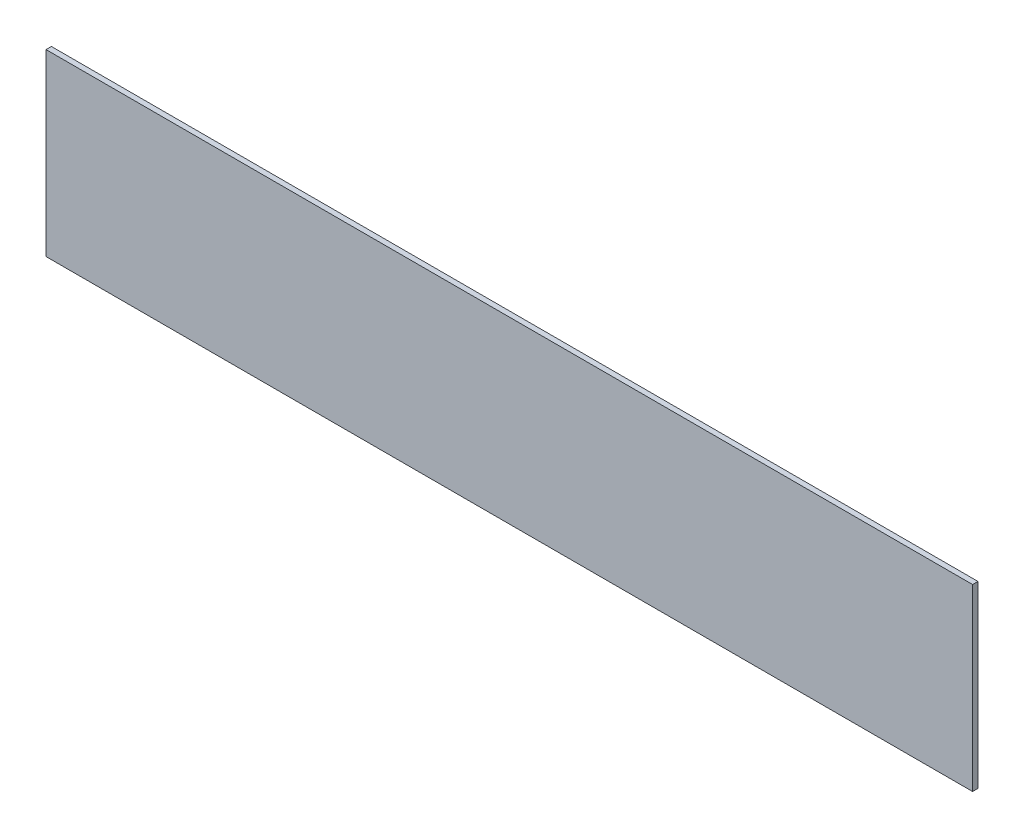
ISO-10303-21;
HEADER;
FILE_DESCRIPTION(('STEP AP214'),'2;1');
FILE_NAME('part.step','',(''),(''),'','','');
FILE_SCHEMA(('AUTOMOTIVE_DESIGN { 1 0 10303 214 1 1 1 1 }'));
ENDSEC;
DATA;
#1=APPLICATION_CONTEXT('core data for automotive mechanical design processes');
#2=APPLICATION_PROTOCOL_DEFINITION('international standard','automotive_design',2000,#1);
#3=PRODUCT_CONTEXT('',#1,'mechanical');
#4=PRODUCT('Part','Part','',(#3));
#5=PRODUCT_RELATED_PRODUCT_CATEGORY('part','',(#4));
#6=PRODUCT_DEFINITION_FORMATION('','',#4);
#7=PRODUCT_DEFINITION_CONTEXT('part definition',#1,'design');
#8=PRODUCT_DEFINITION('design','',#6,#7);
#9=PRODUCT_DEFINITION_SHAPE('','',#8);
#10=(LENGTH_UNIT() NAMED_UNIT(*) SI_UNIT(.MILLI.,.METRE.));
#11=(NAMED_UNIT(*) PLANE_ANGLE_UNIT() SI_UNIT($,.RADIAN.));
#12=(NAMED_UNIT(*) SI_UNIT($,.STERADIAN.) SOLID_ANGLE_UNIT());
#13=UNCERTAINTY_MEASURE_WITH_UNIT(LENGTH_MEASURE(1.E-05),#10,'distance_accuracy_value','');
#14=(GEOMETRIC_REPRESENTATION_CONTEXT(3) GLOBAL_UNCERTAINTY_ASSIGNED_CONTEXT((#13)) GLOBAL_UNIT_ASSIGNED_CONTEXT((#10,
#11,#12)) REPRESENTATION_CONTEXT('',''));
#15=CARTESIAN_POINT('',(0.,0.,0.));
#16=DIRECTION('',(0.,0.,1.));
#17=DIRECTION('',(1.,0.,0.));
#18=AXIS2_PLACEMENT_3D('',#15,#16,#17);
#19=CARTESIAN_POINT('',(0.,0.,0.24));
#20=DIRECTION('',(1.,0.,0.));
#21=DIRECTION('',(0.,0.,-1.));
#22=AXIS2_PLACEMENT_3D('',#19,#20,#21);
#23=PLANE('',#22);
#24=DIRECTION('',(0.,-1.,0.));
#25=VECTOR('',#24,1.);
#26=CARTESIAN_POINT('',(0.,0.,0.));
#27=LINE('',#26,#25);
#28=CARTESIAN_POINT('',(0.,8.,0.));
#29=VERTEX_POINT('',#28);
#30=CARTESIAN_POINT('',(0.,0.,0.));
#31=VERTEX_POINT('',#30);
#32=EDGE_CURVE('E107',#29,#31,#27,.T.);
#33=ORIENTED_EDGE('',*,*,#32,.T.);
#34=DIRECTION('',(0.,0.,-1.));
#35=VECTOR('',#34,1.);
#36=CARTESIAN_POINT('',(0.,0.,0.24));
#37=LINE('',#36,#35);
#38=CARTESIAN_POINT('',(0.,0.,0.24));
#39=VERTEX_POINT('',#38);
#40=EDGE_CURVE('E11',#39,#31,#37,.T.);
#41=ORIENTED_EDGE('',*,*,#40,.F.);
#42=DIRECTION('',(0.,-1.,0.));
#43=VECTOR('',#42,1.);
#44=CARTESIAN_POINT('',(0.,0.,0.24));
#45=LINE('',#44,#43);
#46=CARTESIAN_POINT('',(0.,8.,0.24));
#47=VERTEX_POINT('',#46);
#48=EDGE_CURVE('E91',#47,#39,#45,.T.);
#49=ORIENTED_EDGE('',*,*,#48,.F.);
#50=DIRECTION('',(0.,0.,-1.));
#51=VECTOR('',#50,1.);
#52=CARTESIAN_POINT('',(0.,8.,0.24));
#53=LINE('',#52,#51);
#54=EDGE_CURVE('E103',#47,#29,#53,.T.);
#55=ORIENTED_EDGE('',*,*,#54,.T.);
#56=EDGE_LOOP('',(#33,#41,#49,#55));
#57=FACE_BOUND('',#56,.T.);
#58=ADVANCED_FACE('F39',(#57),#23,.F.);
#59=CARTESIAN_POINT('',(0.,0.,0.24));
#60=DIRECTION('',(0.,1.,0.));
#61=DIRECTION('',(0.,0.,1.));
#62=AXIS2_PLACEMENT_3D('',#59,#60,#61);
#63=PLANE('',#62);
#64=DIRECTION('',(1.,0.,0.));
#65=VECTOR('',#64,1.);
#66=CARTESIAN_POINT('',(0.,0.,0.));
#67=LINE('',#66,#65);
#68=CARTESIAN_POINT('',(41.35,0.,0.));
#69=VERTEX_POINT('',#68);
#70=EDGE_CURVE('E96',#31,#69,#67,.T.);
#71=ORIENTED_EDGE('',*,*,#70,.T.);
#72=DIRECTION('',(0.,0.,-1.));
#73=VECTOR('',#72,1.);
#74=CARTESIAN_POINT('',(41.35,0.,0.24));
#75=LINE('',#74,#73);
#76=CARTESIAN_POINT('',(41.35,0.,0.24));
#77=VERTEX_POINT('',#76);
#78=EDGE_CURVE('E48',#77,#69,#75,.T.);
#79=ORIENTED_EDGE('',*,*,#78,.F.);
#80=DIRECTION('',(1.,0.,0.));
#81=VECTOR('',#80,1.);
#82=CARTESIAN_POINT('',(0.,0.,0.24));
#83=LINE('',#82,#81);
#84=EDGE_CURVE('E86',#39,#77,#83,.T.);
#85=ORIENTED_EDGE('',*,*,#84,.F.);
#86=ORIENTED_EDGE('',*,*,#40,.T.);
#87=EDGE_LOOP('',(#71,#79,#85,#86));
#88=FACE_BOUND('',#87,.T.);
#89=ADVANCED_FACE('F95',(#88),#63,.F.);
#90=CARTESIAN_POINT('',(41.35,0.,0.24));
#91=DIRECTION('',(-1.,0.,0.));
#92=DIRECTION('',(0.,0.,1.));
#93=AXIS2_PLACEMENT_3D('',#90,#91,#92);
#94=PLANE('',#93);
#95=DIRECTION('',(0.,1.,0.));
#96=VECTOR('',#95,1.);
#97=CARTESIAN_POINT('',(41.35,0.,0.));
#98=LINE('',#97,#96);
#99=CARTESIAN_POINT('',(41.35,8.,0.));
#100=VERTEX_POINT('',#99);
#101=EDGE_CURVE('E73',#69,#100,#98,.T.);
#102=ORIENTED_EDGE('',*,*,#101,.T.);
#103=DIRECTION('',(0.,0.,-1.));
#104=VECTOR('',#103,1.);
#105=CARTESIAN_POINT('',(41.35,8.,0.24));
#106=LINE('',#105,#104);
#107=CARTESIAN_POINT('',(41.35,8.,0.24));
#108=VERTEX_POINT('',#107);
#109=EDGE_CURVE('E98',#108,#100,#106,.T.);
#110=ORIENTED_EDGE('',*,*,#109,.F.);
#111=DIRECTION('',(0.,1.,0.));
#112=VECTOR('',#111,1.);
#113=CARTESIAN_POINT('',(41.35,0.,0.24));
#114=LINE('',#113,#112);
#115=EDGE_CURVE('E89',#77,#108,#114,.T.);
#116=ORIENTED_EDGE('',*,*,#115,.F.);
#117=ORIENTED_EDGE('',*,*,#78,.T.);
#118=EDGE_LOOP('',(#102,#110,#116,#117));
#119=FACE_BOUND('',#118,.T.);
#120=ADVANCED_FACE('F99',(#119),#94,.F.);
#121=CARTESIAN_POINT('',(0.,8.,0.24));
#122=DIRECTION('',(0.,-1.,0.));
#123=DIRECTION('',(0.,0.,-1.));
#124=AXIS2_PLACEMENT_3D('',#121,#122,#123);
#125=PLANE('',#124);
#126=DIRECTION('',(-1.,0.,0.));
#127=VECTOR('',#126,1.);
#128=CARTESIAN_POINT('',(0.,8.,0.));
#129=LINE('',#128,#127);
#130=EDGE_CURVE('E79',#100,#29,#129,.T.);
#131=ORIENTED_EDGE('',*,*,#130,.T.);
#132=ORIENTED_EDGE('',*,*,#54,.F.);
#133=DIRECTION('',(-1.,0.,0.));
#134=VECTOR('',#133,1.);
#135=CARTESIAN_POINT('',(0.,8.,0.24));
#136=LINE('',#135,#134);
#137=EDGE_CURVE('E56',#108,#47,#136,.T.);
#138=ORIENTED_EDGE('',*,*,#137,.F.);
#139=ORIENTED_EDGE('',*,*,#109,.T.);
#140=EDGE_LOOP('',(#131,#132,#138,#139));
#141=FACE_BOUND('',#140,.T.);
#142=ADVANCED_FACE('F120',(#141),#125,.F.);
#143=CARTESIAN_POINT('',(0.,0.,0.24));
#144=DIRECTION('',(0.,0.,-1.));
#145=DIRECTION('',(-1.,0.,0.));
#146=AXIS2_PLACEMENT_3D('',#143,#144,#145);
#147=PLANE('',#146);
#148=ORIENTED_EDGE('',*,*,#48,.T.);
#149=ORIENTED_EDGE('',*,*,#84,.T.);
#150=ORIENTED_EDGE('',*,*,#115,.T.);
#151=ORIENTED_EDGE('',*,*,#137,.T.);
#152=EDGE_LOOP('',(#148,#149,#150,#151));
#153=FACE_BOUND('',#152,.T.);
#154=ADVANCED_FACE('F87',(#153),#147,.F.);
#155=CARTESIAN_POINT('',(0.,0.,0.));
#156=DIRECTION('',(0.,0.,-1.));
#157=DIRECTION('',(-1.,0.,0.));
#158=AXIS2_PLACEMENT_3D('',#155,#156,#157);
#159=PLANE('',#158);
#160=ORIENTED_EDGE('',*,*,#32,.F.);
#161=ORIENTED_EDGE('',*,*,#130,.F.);
#162=ORIENTED_EDGE('',*,*,#101,.F.);
#163=ORIENTED_EDGE('',*,*,#70,.F.);
#164=EDGE_LOOP('',(#160,#161,#162,#163));
#165=FACE_BOUND('',#164,.T.);
#166=ADVANCED_FACE('F123',(#165),#159,.T.);
#167=CLOSED_SHELL('',(#58,#89,#120,#142,#154,#166));
#168=MANIFOLD_SOLID_BREP('B2',#167);
#169=ADVANCED_BREP_SHAPE_REPRESENTATION('',(#18,#168),#14);
#170=SHAPE_DEFINITION_REPRESENTATION(#9,#169);
ENDSEC;
END-ISO-10303-21;
